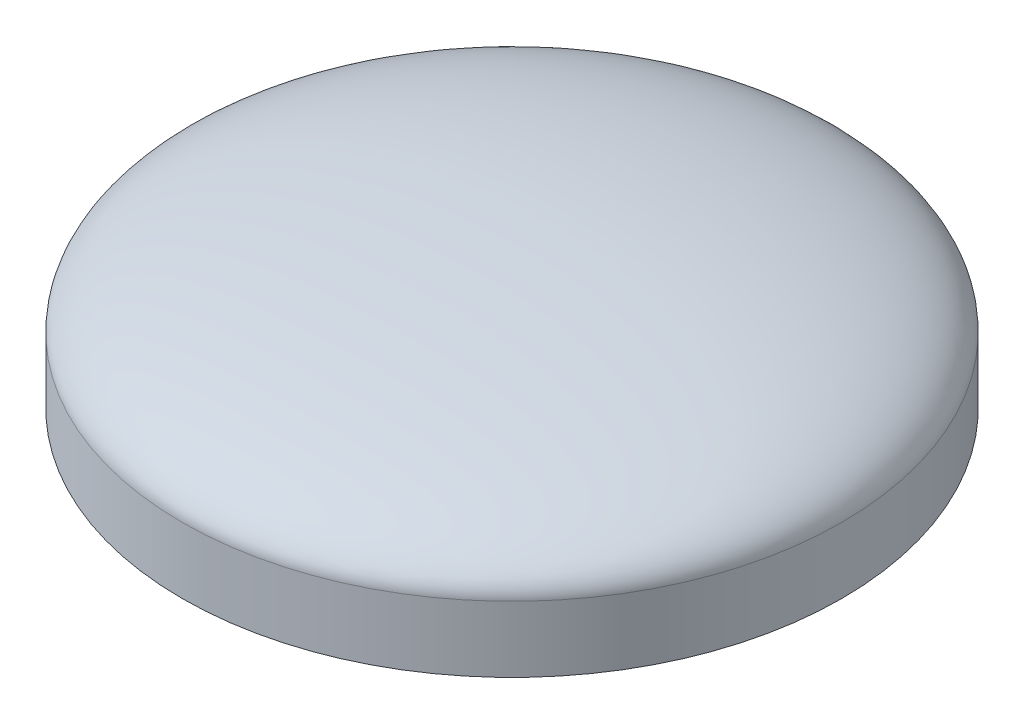
ISO-10303-21;
HEADER;
FILE_DESCRIPTION(('STEP AP214'),'2;1');
FILE_NAME('part.step','',(''),(''),'','','');
FILE_SCHEMA(('AUTOMOTIVE_DESIGN { 1 0 10303 214 1 1 1 1 }'));
ENDSEC;
DATA;
#1=APPLICATION_CONTEXT('core data for automotive mechanical design processes');
#2=APPLICATION_PROTOCOL_DEFINITION('international standard','automotive_design',2000,#1);
#3=PRODUCT_CONTEXT('',#1,'mechanical');
#4=PRODUCT('Part','Part','',(#3));
#5=PRODUCT_RELATED_PRODUCT_CATEGORY('part','',(#4));
#6=PRODUCT_DEFINITION_FORMATION('','',#4);
#7=PRODUCT_DEFINITION_CONTEXT('part definition',#1,'design');
#8=PRODUCT_DEFINITION('design','',#6,#7);
#9=PRODUCT_DEFINITION_SHAPE('','',#8);
#10=(LENGTH_UNIT() NAMED_UNIT(*) SI_UNIT(.MILLI.,.METRE.));
#11=(NAMED_UNIT(*) PLANE_ANGLE_UNIT() SI_UNIT($,.RADIAN.));
#12=(NAMED_UNIT(*) SI_UNIT($,.STERADIAN.) SOLID_ANGLE_UNIT());
#13=UNCERTAINTY_MEASURE_WITH_UNIT(LENGTH_MEASURE(1.E-05),#10,'distance_accuracy_value','');
#14=(GEOMETRIC_REPRESENTATION_CONTEXT(3) GLOBAL_UNCERTAINTY_ASSIGNED_CONTEXT((#13)) GLOBAL_UNIT_ASSIGNED_CONTEXT((#10,
#11,#12)) REPRESENTATION_CONTEXT('',''));
#15=CARTESIAN_POINT('',(0.,0.,0.));
#16=DIRECTION('',(0.,0.,1.));
#17=DIRECTION('',(1.,0.,0.));
#18=AXIS2_PLACEMENT_3D('',#15,#16,#17);
#19=CARTESIAN_POINT('',(0.,20.,0.));
#20=DIRECTION('',(0.,-1.,0.));
#21=DIRECTION('',(0.,0.,-1.));
#22=AXIS2_PLACEMENT_3D('',#19,#20,#21);
#23=CYLINDRICAL_SURFACE('',#22,100.);
#24=CARTESIAN_POINT('',(0.,20.,0.));
#25=DIRECTION('',(0.,1.,0.));
#26=DIRECTION('',(0.,0.,1.));
#27=AXIS2_PLACEMENT_3D('',#24,#25,#26);
#28=CIRCLE('',#27,100.);
#29=CARTESIAN_POINT('',(0.,20.,100.));
#30=VERTEX_POINT('',#29);
#31=EDGE_CURVE('E11',#30,#30,#28,.T.);
#32=ORIENTED_EDGE('',*,*,#31,.F.);
#33=EDGE_LOOP('',(#32));
#34=FACE_BOUND('',#33,.T.);
#35=CARTESIAN_POINT('',(0.,0.,0.));
#36=DIRECTION('',(0.,1.,0.));
#37=DIRECTION('',(0.,0.,1.));
#38=AXIS2_PLACEMENT_3D('',#35,#36,#37);
#39=CIRCLE('',#38,100.);
#40=CARTESIAN_POINT('',(0.,0.,100.));
#41=VERTEX_POINT('',#40);
#42=EDGE_CURVE('E35',#41,#41,#39,.T.);
#43=ORIENTED_EDGE('',*,*,#42,.T.);
#44=EDGE_LOOP('',(#43));
#45=FACE_BOUND('',#44,.T.);
#46=ADVANCED_FACE('F32',(#34,#45),#23,.T.);
#47=CARTESIAN_POINT('',(0.,0.,0.));
#48=DIRECTION('',(0.,1.,0.));
#49=DIRECTION('',(0.,0.,1.));
#50=AXIS2_PLACEMENT_3D('',#47,#48,#49);
#51=PLANE('',#50);
#52=CARTESIAN_POINT('',(0.,0.,0.));
#53=DIRECTION('',(0.,1.,0.));
#54=DIRECTION('',(0.,0.,1.));
#55=AXIS2_PLACEMENT_3D('',#52,#53,#54);
#56=CIRCLE('',#55,98.);
#57=CARTESIAN_POINT('',(0.,0.,98.));
#58=VERTEX_POINT('',#57);
#59=EDGE_CURVE('E72',#58,#58,#56,.T.);
#60=ORIENTED_EDGE('',*,*,#59,.T.);
#61=EDGE_LOOP('',(#60));
#62=FACE_BOUND('',#61,.T.);
#63=ORIENTED_EDGE('',*,*,#42,.F.);
#64=EDGE_LOOP('',(#63));
#65=FACE_BOUND('',#64,.T.);
#66=ADVANCED_FACE('F59',(#62,#65),#51,.F.);
#67=CARTESIAN_POINT('',(0.,20.,0.));
#68=DIRECTION('',(0.,0.,1.));
#69=DIRECTION('',(-1.,0.,0.));
#70=AXIS2_PLACEMENT_3D('',#67,#68,#69);
#71=ELLIPSE('',#70,100.,25.);
#72=TRIMMED_CURVE('',#71,(PARAMETER_VALUE(4.71238898038469)),
(PARAMETER_VALUE(7.85398163397448)),.T.,.PARAMETER.);
#73=CARTESIAN_POINT('',(0.,20.,0.));
#74=DIRECTION('',(0.,-1.,0.));
#75=AXIS1_PLACEMENT('',#73,#74);
#76=SURFACE_OF_REVOLUTION('',#72,#75);
#77=ORIENTED_EDGE('',*,*,#31,.T.);
#78=EDGE_LOOP('',(#77));
#79=FACE_BOUND('',#78,.T.);
#80=CARTESIAN_POINT('',(0.,45.,0.));
#81=VERTEX_POINT('',#80);
#82=VERTEX_LOOP('',#81);
#83=FACE_BOUND('',#82,.T.);
#84=ADVANCED_FACE('F53',(#79,#83),#76,.T.);
#85=CARTESIAN_POINT('',(0.,20.,0.));
#86=DIRECTION('',(0.,-1.,0.));
#87=DIRECTION('',(0.,0.,-1.));
#88=AXIS2_PLACEMENT_3D('',#85,#86,#87);
#89=CYLINDRICAL_SURFACE('',#88,98.);
#90=CARTESIAN_POINT('',(0.,19.9999999999999,0.));
#91=DIRECTION('',(0.,-1.,0.));
#92=DIRECTION('',(-1.,0.,0.));
#93=AXIS2_PLACEMENT_3D('',#90,#91,#92);
#94=CIRCLE('',#93,98.);
#95=CARTESIAN_POINT('',(-98.,20.,0.));
#96=VERTEX_POINT('',#95);
#97=EDGE_CURVE('E70',#96,#96,#94,.F.);
#98=ORIENTED_EDGE('',*,*,#97,.T.);
#99=EDGE_LOOP('',(#98));
#100=FACE_BOUND('',#99,.T.);
#101=ORIENTED_EDGE('',*,*,#59,.F.);
#102=EDGE_LOOP('',(#101));
#103=FACE_BOUND('',#102,.T.);
#104=ADVANCED_FACE('F47',(#100,#103),#89,.F.);
#105=CARTESIAN_POINT('',(0.,20.,0.));
#106=DIRECTION('',(0.,0.,1.));
#107=DIRECTION('',(-1.,0.,0.));
#108=AXIS2_PLACEMENT_3D('',#105,#106,#107);
#109=ELLIPSE('',#108,100.,25.);
#110=TRIMMED_CURVE('',#109,(PARAMETER_VALUE(4.71238898038469)),
(PARAMETER_VALUE(7.85398163397448)),.T.,.PARAMETER.);
#111=CARTESIAN_POINT('',(0.,20.,0.));
#112=DIRECTION('',(0.,-1.,0.));
#113=AXIS1_PLACEMENT('',#111,#112);
#114=SURFACE_OF_REVOLUTION('',#110,#113);
#115=OFFSET_SURFACE('',#114,-2.,.F.);
#116=ORIENTED_EDGE('',*,*,#97,.F.);
#117=EDGE_LOOP('',(#116));
#118=FACE_BOUND('',#117,.T.);
#119=CARTESIAN_POINT('',(0.,43.,0.));
#120=VERTEX_POINT('',#119);
#121=VERTEX_LOOP('',#120);
#122=FACE_BOUND('',#121,.T.);
#123=ADVANCED_FACE('F45',(#118,#122),#115,.F.);
#124=CLOSED_SHELL('',(#46,#66,#84,#104,#123));
#125=MANIFOLD_SOLID_BREP('B2',#124);
#126=ADVANCED_BREP_SHAPE_REPRESENTATION('',(#18,#125),#14);
#127=SHAPE_DEFINITION_REPRESENTATION(#9,#126);
ENDSEC;
END-ISO-10303-21;
